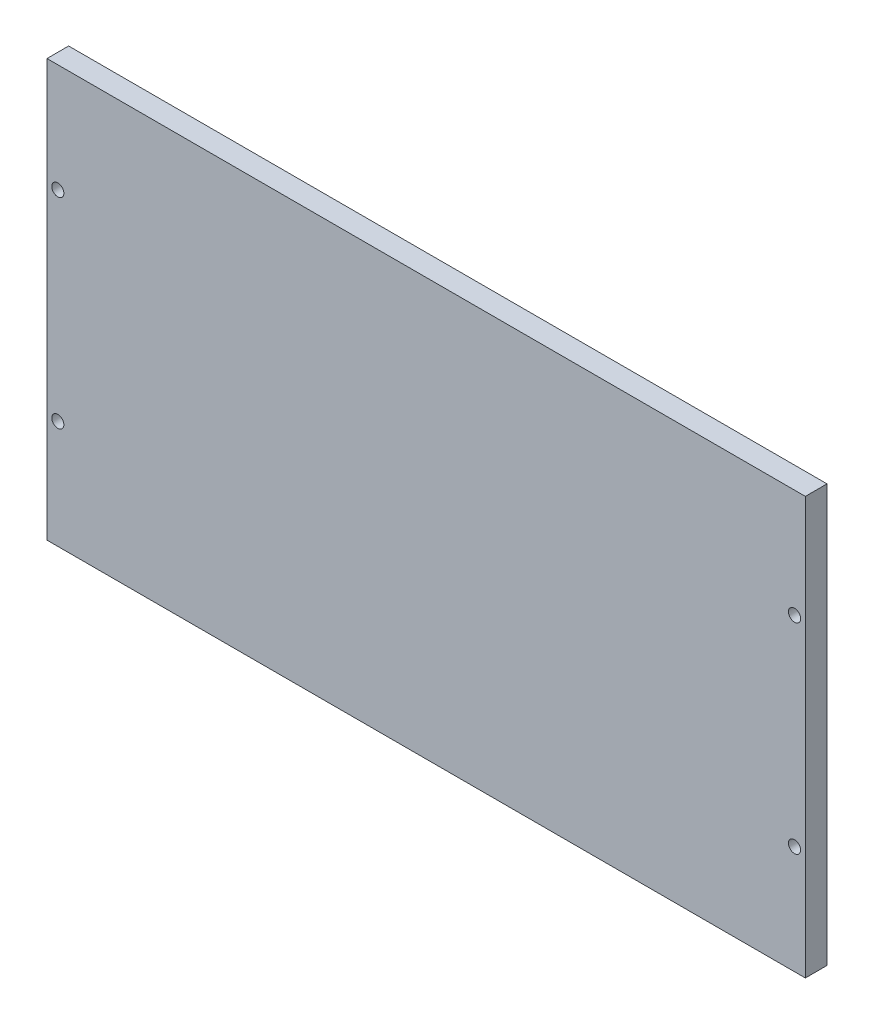
ISO-10303-21;
HEADER;
FILE_DESCRIPTION(('STEP AP214'),'2;1');
FILE_NAME('part.step','',(''),(''),'','','');
FILE_SCHEMA(('AUTOMOTIVE_DESIGN { 1 0 10303 214 1 1 1 1 }'));
ENDSEC;
DATA;
#1=APPLICATION_CONTEXT('core data for automotive mechanical design processes');
#2=APPLICATION_PROTOCOL_DEFINITION('international standard','automotive_design',2000,#1);
#3=PRODUCT_CONTEXT('',#1,'mechanical');
#4=PRODUCT('Part','Part','',(#3));
#5=PRODUCT_RELATED_PRODUCT_CATEGORY('part','',(#4));
#6=PRODUCT_DEFINITION_FORMATION('','',#4);
#7=PRODUCT_DEFINITION_CONTEXT('part definition',#1,'design');
#8=PRODUCT_DEFINITION('design','',#6,#7);
#9=PRODUCT_DEFINITION_SHAPE('','',#8);
#10=(LENGTH_UNIT() NAMED_UNIT(*) SI_UNIT(.MILLI.,.METRE.));
#11=(NAMED_UNIT(*) PLANE_ANGLE_UNIT() SI_UNIT($,.RADIAN.));
#12=(NAMED_UNIT(*) SI_UNIT($,.STERADIAN.) SOLID_ANGLE_UNIT());
#13=UNCERTAINTY_MEASURE_WITH_UNIT(LENGTH_MEASURE(1.E-05),#10,'distance_accuracy_value','');
#14=(GEOMETRIC_REPRESENTATION_CONTEXT(3) GLOBAL_UNCERTAINTY_ASSIGNED_CONTEXT((#13)) GLOBAL_UNIT_ASSIGNED_CONTEXT((#10,
#11,#12)) REPRESENTATION_CONTEXT('',''));
#15=CARTESIAN_POINT('',(0.,0.,0.));
#16=DIRECTION('',(0.,0.,1.));
#17=DIRECTION('',(1.,0.,0.));
#18=AXIS2_PLACEMENT_3D('',#15,#16,#17);
#19=CARTESIAN_POINT('',(0.,0.,5.08));
#20=DIRECTION('',(1.,0.,0.));
#21=DIRECTION('',(0.,0.,-1.));
#22=AXIS2_PLACEMENT_3D('',#19,#20,#21);
#23=PLANE('',#22);
#24=DIRECTION('',(0.,-1.,0.));
#25=VECTOR('',#24,1.);
#26=CARTESIAN_POINT('',(0.,0.,0.));
#27=LINE('',#26,#25);
#28=CARTESIAN_POINT('',(0.,97.79,0.));
#29=VERTEX_POINT('',#28);
#30=CARTESIAN_POINT('',(0.,0.,0.));
#31=VERTEX_POINT('',#30);
#32=EDGE_CURVE('E116',#29,#31,#27,.T.);
#33=ORIENTED_EDGE('',*,*,#32,.T.);
#34=DIRECTION('',(0.,0.,-1.));
#35=VECTOR('',#34,1.);
#36=CARTESIAN_POINT('',(0.,0.,5.08));
#37=LINE('',#36,#35);
#38=CARTESIAN_POINT('',(0.,0.,5.08));
#39=VERTEX_POINT('',#38);
#40=EDGE_CURVE('E11',#39,#31,#37,.T.);
#41=ORIENTED_EDGE('',*,*,#40,.F.);
#42=DIRECTION('',(0.,-1.,0.));
#43=VECTOR('',#42,1.);
#44=CARTESIAN_POINT('',(0.,0.,5.08));
#45=LINE('',#44,#43);
#46=CARTESIAN_POINT('',(0.,97.79,5.08));
#47=VERTEX_POINT('',#46);
#48=EDGE_CURVE('E99',#47,#39,#45,.T.);
#49=ORIENTED_EDGE('',*,*,#48,.F.);
#50=DIRECTION('',(0.,0.,-1.));
#51=VECTOR('',#50,1.);
#52=CARTESIAN_POINT('',(0.,97.79,5.08));
#53=LINE('',#52,#51);
#54=EDGE_CURVE('E112',#47,#29,#53,.T.);
#55=ORIENTED_EDGE('',*,*,#54,.T.);
#56=EDGE_LOOP('',(#33,#41,#49,#55));
#57=FACE_BOUND('',#56,.T.);
#58=ADVANCED_FACE('F45',(#57),#23,.F.);
#59=CARTESIAN_POINT('',(0.,0.,5.08));
#60=DIRECTION('',(0.,1.,0.));
#61=DIRECTION('',(0.,0.,1.));
#62=AXIS2_PLACEMENT_3D('',#59,#60,#61);
#63=PLANE('',#62);
#64=DIRECTION('',(1.,0.,0.));
#65=VECTOR('',#64,1.);
#66=CARTESIAN_POINT('',(0.,0.,0.));
#67=LINE('',#66,#65);
#68=CARTESIAN_POINT('',(177.8,0.,0.));
#69=VERTEX_POINT('',#68);
#70=EDGE_CURVE('E104',#31,#69,#67,.T.);
#71=ORIENTED_EDGE('',*,*,#70,.T.);
#72=DIRECTION('',(0.,0.,-1.));
#73=VECTOR('',#72,1.);
#74=CARTESIAN_POINT('',(177.8,0.,5.08));
#75=LINE('',#74,#73);
#76=CARTESIAN_POINT('',(177.8,0.,5.08));
#77=VERTEX_POINT('',#76);
#78=EDGE_CURVE('E55',#77,#69,#75,.T.);
#79=ORIENTED_EDGE('',*,*,#78,.F.);
#80=DIRECTION('',(1.,0.,0.));
#81=VECTOR('',#80,1.);
#82=CARTESIAN_POINT('',(0.,0.,5.08));
#83=LINE('',#82,#81);
#84=EDGE_CURVE('E94',#39,#77,#83,.T.);
#85=ORIENTED_EDGE('',*,*,#84,.F.);
#86=ORIENTED_EDGE('',*,*,#40,.T.);
#87=EDGE_LOOP('',(#71,#79,#85,#86));
#88=FACE_BOUND('',#87,.T.);
#89=ADVANCED_FACE('F103',(#88),#63,.F.);
#90=CARTESIAN_POINT('',(177.8,0.,5.08));
#91=DIRECTION('',(-1.,0.,0.));
#92=DIRECTION('',(0.,0.,1.));
#93=AXIS2_PLACEMENT_3D('',#90,#91,#92);
#94=PLANE('',#93);
#95=DIRECTION('',(0.,1.,0.));
#96=VECTOR('',#95,1.);
#97=CARTESIAN_POINT('',(177.8,0.,0.));
#98=LINE('',#97,#96);
#99=CARTESIAN_POINT('',(177.8,97.79,0.));
#100=VERTEX_POINT('',#99);
#101=EDGE_CURVE('E81',#69,#100,#98,.T.);
#102=ORIENTED_EDGE('',*,*,#101,.T.);
#103=DIRECTION('',(0.,0.,-1.));
#104=VECTOR('',#103,1.);
#105=CARTESIAN_POINT('',(177.8,97.79,5.08));
#106=LINE('',#105,#104);
#107=CARTESIAN_POINT('',(177.8,97.79,5.08));
#108=VERTEX_POINT('',#107);
#109=EDGE_CURVE('E106',#108,#100,#106,.T.);
#110=ORIENTED_EDGE('',*,*,#109,.F.);
#111=DIRECTION('',(0.,1.,0.));
#112=VECTOR('',#111,1.);
#113=CARTESIAN_POINT('',(177.8,0.,5.08));
#114=LINE('',#113,#112);
#115=EDGE_CURVE('E97',#77,#108,#114,.T.);
#116=ORIENTED_EDGE('',*,*,#115,.F.);
#117=ORIENTED_EDGE('',*,*,#78,.T.);
#118=EDGE_LOOP('',(#102,#110,#116,#117));
#119=FACE_BOUND('',#118,.T.);
#120=ADVANCED_FACE('F108',(#119),#94,.F.);
#121=CARTESIAN_POINT('',(0.,97.79,5.08));
#122=DIRECTION('',(0.,-1.,0.));
#123=DIRECTION('',(0.,0.,-1.));
#124=AXIS2_PLACEMENT_3D('',#121,#122,#123);
#125=PLANE('',#124);
#126=DIRECTION('',(-1.,0.,0.));
#127=VECTOR('',#126,1.);
#128=CARTESIAN_POINT('',(0.,97.79,0.));
#129=LINE('',#128,#127);
#130=EDGE_CURVE('E87',#100,#29,#129,.T.);
#131=ORIENTED_EDGE('',*,*,#130,.T.);
#132=ORIENTED_EDGE('',*,*,#54,.F.);
#133=DIRECTION('',(-1.,0.,0.));
#134=VECTOR('',#133,1.);
#135=CARTESIAN_POINT('',(0.,97.79,5.08));
#136=LINE('',#135,#134);
#137=EDGE_CURVE('E64',#108,#47,#136,.T.);
#138=ORIENTED_EDGE('',*,*,#137,.F.);
#139=ORIENTED_EDGE('',*,*,#109,.T.);
#140=EDGE_LOOP('',(#131,#132,#138,#139));
#141=FACE_BOUND('',#140,.T.);
#142=ADVANCED_FACE('F162',(#141),#125,.F.);
#143=CARTESIAN_POINT('',(0.,0.,5.08));
#144=DIRECTION('',(0.,0.,-1.));
#145=DIRECTION('',(-1.,0.,0.));
#146=AXIS2_PLACEMENT_3D('',#143,#144,#145);
#147=PLANE('',#146);
#148=CARTESIAN_POINT('',(175.26,72.39,5.08));
#149=DIRECTION('',(0.,0.,1.));
#150=DIRECTION('',(1.,0.,0.));
#151=AXIS2_PLACEMENT_3D('',#148,#149,#150);
#152=CIRCLE('',#151,1.4224);
#153=CARTESIAN_POINT('',(176.6824,72.39,5.08));
#154=VERTEX_POINT('',#153);
#155=EDGE_CURVE('E246',#154,#154,#152,.T.);
#156=ORIENTED_EDGE('',*,*,#155,.F.);
#157=EDGE_LOOP('',(#156));
#158=FACE_BOUND('',#157,.T.);
#159=CARTESIAN_POINT('',(175.26,25.4,5.08));
#160=DIRECTION('',(0.,0.,1.));
#161=DIRECTION('',(1.,0.,0.));
#162=AXIS2_PLACEMENT_3D('',#159,#160,#161);
#163=CIRCLE('',#162,1.42239999999999);
#164=CARTESIAN_POINT('',(176.6824,25.4,5.08));
#165=VERTEX_POINT('',#164);
#166=EDGE_CURVE('E242',#165,#165,#163,.T.);
#167=ORIENTED_EDGE('',*,*,#166,.F.);
#168=EDGE_LOOP('',(#167));
#169=FACE_BOUND('',#168,.T.);
#170=CARTESIAN_POINT('',(2.54000000000001,25.4,5.08));
#171=DIRECTION('',(0.,0.,1.));
#172=DIRECTION('',(1.,0.,0.));
#173=AXIS2_PLACEMENT_3D('',#170,#171,#172);
#174=CIRCLE('',#173,1.4224);
#175=CARTESIAN_POINT('',(3.96240000000001,25.4,5.08));
#176=VERTEX_POINT('',#175);
#177=EDGE_CURVE('E245',#176,#176,#174,.T.);
#178=ORIENTED_EDGE('',*,*,#177,.F.);
#179=EDGE_LOOP('',(#178));
#180=FACE_BOUND('',#179,.T.);
#181=CARTESIAN_POINT('',(2.54,72.39,5.08));
#182=DIRECTION('',(0.,0.,1.));
#183=DIRECTION('',(1.,0.,0.));
#184=AXIS2_PLACEMENT_3D('',#181,#182,#183);
#185=CIRCLE('',#184,1.4224);
#186=CARTESIAN_POINT('',(3.96240000000001,72.39,5.08));
#187=VERTEX_POINT('',#186);
#188=EDGE_CURVE('E135',#187,#187,#185,.T.);
#189=ORIENTED_EDGE('',*,*,#188,.F.);
#190=EDGE_LOOP('',(#189));
#191=FACE_BOUND('',#190,.T.);
#192=ORIENTED_EDGE('',*,*,#48,.T.);
#193=ORIENTED_EDGE('',*,*,#84,.T.);
#194=ORIENTED_EDGE('',*,*,#115,.T.);
#195=ORIENTED_EDGE('',*,*,#137,.T.);
#196=EDGE_LOOP('',(#192,#193,#194,#195));
#197=FACE_BOUND('',#196,.T.);
#198=ADVANCED_FACE('F95',(#158,#169,#180,#191,#197),#147,.F.);
#199=CARTESIAN_POINT('',(0.,0.,0.));
#200=DIRECTION('',(0.,0.,-1.));
#201=DIRECTION('',(-1.,0.,0.));
#202=AXIS2_PLACEMENT_3D('',#199,#200,#201);
#203=PLANE('',#202);
#204=CARTESIAN_POINT('',(175.26,72.39,0.));
#205=DIRECTION('',(0.,0.,-1.));
#206=DIRECTION('',(-1.,0.,0.));
#207=AXIS2_PLACEMENT_3D('',#204,#205,#206);
#208=CIRCLE('',#207,1.4224);
#209=CARTESIAN_POINT('',(173.8376,72.39,0.));
#210=VERTEX_POINT('',#209);
#211=EDGE_CURVE('E48',#210,#210,#208,.T.);
#212=ORIENTED_EDGE('',*,*,#211,.F.);
#213=EDGE_LOOP('',(#212));
#214=FACE_BOUND('',#213,.T.);
#215=CARTESIAN_POINT('',(175.26,25.4,0.));
#216=DIRECTION('',(0.,0.,-1.));
#217=DIRECTION('',(-1.,0.,0.));
#218=AXIS2_PLACEMENT_3D('',#215,#216,#217);
#219=CIRCLE('',#218,1.42239999999999);
#220=CARTESIAN_POINT('',(173.8376,25.4,0.));
#221=VERTEX_POINT('',#220);
#222=EDGE_CURVE('E138',#221,#221,#219,.T.);
#223=ORIENTED_EDGE('',*,*,#222,.F.);
#224=EDGE_LOOP('',(#223));
#225=FACE_BOUND('',#224,.T.);
#226=CARTESIAN_POINT('',(2.54000000000001,25.4,0.));
#227=DIRECTION('',(0.,0.,-1.));
#228=DIRECTION('',(-1.,0.,0.));
#229=AXIS2_PLACEMENT_3D('',#226,#227,#228);
#230=CIRCLE('',#229,1.4224);
#231=CARTESIAN_POINT('',(1.11760000000001,25.4,0.));
#232=VERTEX_POINT('',#231);
#233=EDGE_CURVE('E134',#232,#232,#230,.T.);
#234=ORIENTED_EDGE('',*,*,#233,.F.);
#235=EDGE_LOOP('',(#234));
#236=FACE_BOUND('',#235,.T.);
#237=CARTESIAN_POINT('',(2.54,72.39,0.));
#238=DIRECTION('',(0.,0.,-1.));
#239=DIRECTION('',(-1.,0.,0.));
#240=AXIS2_PLACEMENT_3D('',#237,#238,#239);
#241=CIRCLE('',#240,1.4224);
#242=CARTESIAN_POINT('',(1.1176,72.39,0.));
#243=VERTEX_POINT('',#242);
#244=EDGE_CURVE('E130',#243,#243,#241,.T.);
#245=ORIENTED_EDGE('',*,*,#244,.F.);
#246=EDGE_LOOP('',(#245));
#247=FACE_BOUND('',#246,.T.);
#248=ORIENTED_EDGE('',*,*,#32,.F.);
#249=ORIENTED_EDGE('',*,*,#130,.F.);
#250=ORIENTED_EDGE('',*,*,#101,.F.);
#251=ORIENTED_EDGE('',*,*,#70,.F.);
#252=EDGE_LOOP('',(#248,#249,#250,#251));
#253=FACE_BOUND('',#252,.T.);
#254=ADVANCED_FACE('F150',(#214,#225,#236,#247,#253),#203,.T.);
#255=CARTESIAN_POINT('',(2.54,72.39,-20.32));
#256=DIRECTION('',(0.,0.,1.));
#257=DIRECTION('',(1.,0.,0.));
#258=AXIS2_PLACEMENT_3D('',#255,#256,#257);
#259=CYLINDRICAL_SURFACE('',#258,1.4224);
#260=ORIENTED_EDGE('',*,*,#244,.T.);
#261=EDGE_LOOP('',(#260));
#262=FACE_BOUND('',#261,.T.);
#263=ORIENTED_EDGE('',*,*,#188,.T.);
#264=EDGE_LOOP('',(#263));
#265=FACE_BOUND('',#264,.T.);
#266=ADVANCED_FACE('F153',(#262,#265),#259,.F.);
#267=CARTESIAN_POINT('',(2.54000000000001,25.4,-20.32));
#268=DIRECTION('',(0.,0.,1.));
#269=DIRECTION('',(1.,0.,0.));
#270=AXIS2_PLACEMENT_3D('',#267,#268,#269);
#271=CYLINDRICAL_SURFACE('',#270,1.4224);
#272=ORIENTED_EDGE('',*,*,#233,.T.);
#273=EDGE_LOOP('',(#272));
#274=FACE_BOUND('',#273,.T.);
#275=ORIENTED_EDGE('',*,*,#177,.T.);
#276=EDGE_LOOP('',(#275));
#277=FACE_BOUND('',#276,.T.);
#278=ADVANCED_FACE('F209',(#274,#277),#271,.F.);
#279=CARTESIAN_POINT('',(175.26,25.4,-20.32));
#280=DIRECTION('',(0.,0.,1.));
#281=DIRECTION('',(1.,0.,0.));
#282=AXIS2_PLACEMENT_3D('',#279,#280,#281);
#283=CYLINDRICAL_SURFACE('',#282,1.42239999999999);
#284=ORIENTED_EDGE('',*,*,#222,.T.);
#285=EDGE_LOOP('',(#284));
#286=FACE_BOUND('',#285,.T.);
#287=ORIENTED_EDGE('',*,*,#166,.T.);
#288=EDGE_LOOP('',(#287));
#289=FACE_BOUND('',#288,.T.);
#290=ADVANCED_FACE('F219',(#286,#289),#283,.F.);
#291=CARTESIAN_POINT('',(175.26,72.39,-20.32));
#292=DIRECTION('',(0.,0.,1.));
#293=DIRECTION('',(1.,0.,0.));
#294=AXIS2_PLACEMENT_3D('',#291,#292,#293);
#295=CYLINDRICAL_SURFACE('',#294,1.4224);
#296=ORIENTED_EDGE('',*,*,#211,.T.);
#297=EDGE_LOOP('',(#296));
#298=FACE_BOUND('',#297,.T.);
#299=ORIENTED_EDGE('',*,*,#155,.T.);
#300=EDGE_LOOP('',(#299));
#301=FACE_BOUND('',#300,.T.);
#302=ADVANCED_FACE('F147',(#298,#301),#295,.F.);
#303=CLOSED_SHELL('',(#58,#89,#120,#142,#198,#254,#266,#278,#290,#302));
#304=MANIFOLD_SOLID_BREP('B2',#303);
#305=ADVANCED_BREP_SHAPE_REPRESENTATION('',(#18,#304),#14);
#306=SHAPE_DEFINITION_REPRESENTATION(#9,#305);
ENDSEC;
END-ISO-10303-21;
